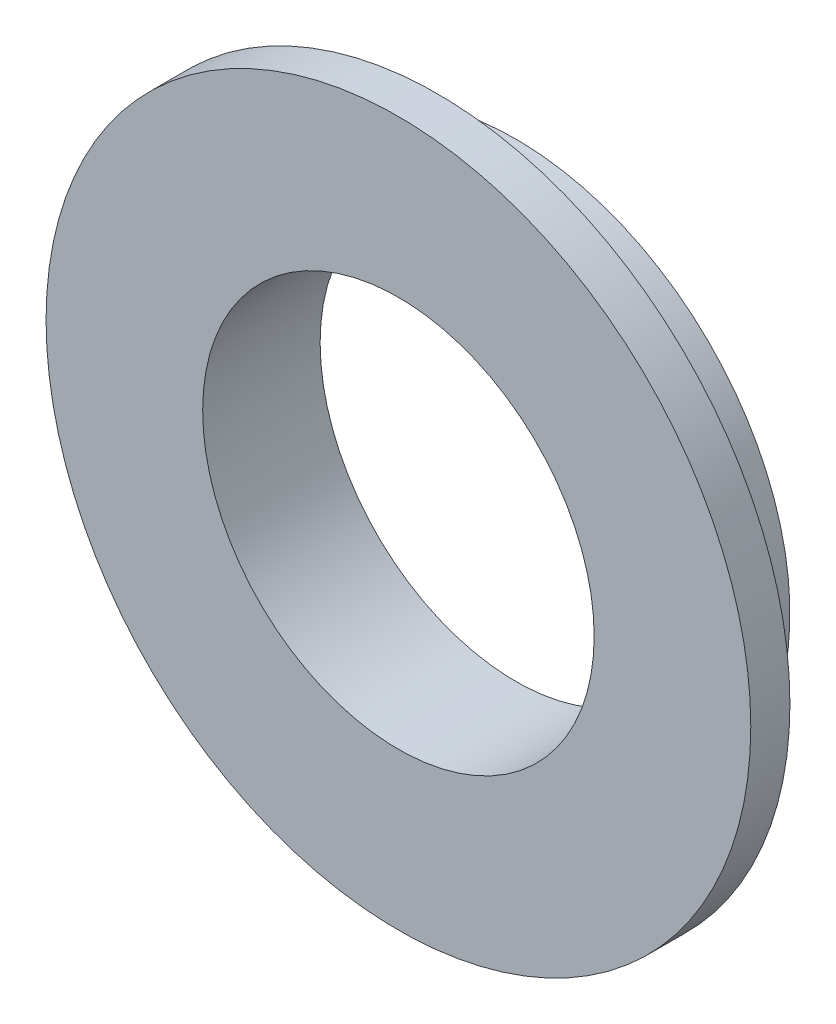
ISO-10303-21;
HEADER;
FILE_DESCRIPTION(('STEP AP214'),'2;1');
FILE_NAME('part.step','',(''),(''),'','','');
FILE_SCHEMA(('AUTOMOTIVE_DESIGN { 1 0 10303 214 1 1 1 1 }'));
ENDSEC;
DATA;
#1=APPLICATION_CONTEXT('core data for automotive mechanical design processes');
#2=APPLICATION_PROTOCOL_DEFINITION('international standard','automotive_design',2000,#1);
#3=PRODUCT_CONTEXT('',#1,'mechanical');
#4=PRODUCT('Part','Part','',(#3));
#5=PRODUCT_RELATED_PRODUCT_CATEGORY('part','',(#4));
#6=PRODUCT_DEFINITION_FORMATION('','',#4);
#7=PRODUCT_DEFINITION_CONTEXT('part definition',#1,'design');
#8=PRODUCT_DEFINITION('design','',#6,#7);
#9=PRODUCT_DEFINITION_SHAPE('','',#8);
#10=(LENGTH_UNIT() NAMED_UNIT(*) SI_UNIT(.MILLI.,.METRE.));
#11=(NAMED_UNIT(*) PLANE_ANGLE_UNIT() SI_UNIT($,.RADIAN.));
#12=(NAMED_UNIT(*) SI_UNIT($,.STERADIAN.) SOLID_ANGLE_UNIT());
#13=UNCERTAINTY_MEASURE_WITH_UNIT(LENGTH_MEASURE(1.E-05),#10,'distance_accuracy_value','');
#14=(GEOMETRIC_REPRESENTATION_CONTEXT(3) GLOBAL_UNCERTAINTY_ASSIGNED_CONTEXT((#13)) GLOBAL_UNIT_ASSIGNED_CONTEXT((#10,
#11,#12)) REPRESENTATION_CONTEXT('',''));
#15=CARTESIAN_POINT('',(0.,0.,0.));
#16=DIRECTION('',(0.,0.,1.));
#17=DIRECTION('',(1.,0.,0.));
#18=AXIS2_PLACEMENT_3D('',#15,#16,#17);
#19=CARTESIAN_POINT('',(0.,0.,-0.5));
#20=DIRECTION('',(0.,0.,1.));
#21=DIRECTION('',(1.,0.,0.));
#22=AXIS2_PLACEMENT_3D('',#19,#20,#21);
#23=CYLINDRICAL_SURFACE('',#22,2.5);
#24=CARTESIAN_POINT('',(0.,0.,0.));
#25=DIRECTION('',(0.,0.,1.));
#26=DIRECTION('',(1.,0.,0.));
#27=AXIS2_PLACEMENT_3D('',#24,#25,#26);
#28=CIRCLE('',#27,2.5);
#29=CARTESIAN_POINT('',(2.5,0.,0.));
#30=VERTEX_POINT('',#29);
#31=EDGE_CURVE('E10',#30,#30,#28,.T.);
#32=ORIENTED_EDGE('',*,*,#31,.T.);
#33=EDGE_LOOP('',(#32));
#34=FACE_BOUND('',#33,.T.);
#35=CARTESIAN_POINT('',(0.,0.,-1.5));
#36=DIRECTION('',(0.,0.,-1.));
#37=DIRECTION('',(-1.,0.,0.));
#38=AXIS2_PLACEMENT_3D('',#35,#36,#37);
#39=CIRCLE('',#38,2.5);
#40=CARTESIAN_POINT('',(-2.5,0.,-1.5));
#41=VERTEX_POINT('',#40);
#42=EDGE_CURVE('E21',#41,#41,#39,.F.);
#43=ORIENTED_EDGE('',*,*,#42,.F.);
#44=EDGE_LOOP('',(#43));
#45=FACE_BOUND('',#44,.T.);
#46=ADVANCED_FACE('F15',(#34,#45),#23,.F.);
#47=CARTESIAN_POINT('',(0.,0.,-0.5));
#48=DIRECTION('',(0.,0.,1.));
#49=DIRECTION('',(1.,0.,0.));
#50=AXIS2_PLACEMENT_3D('',#47,#48,#49);
#51=CYLINDRICAL_SURFACE('',#50,4.5);
#52=CARTESIAN_POINT('',(0.,0.,-0.5));
#53=DIRECTION('',(0.,0.,-1.));
#54=DIRECTION('',(-1.,0.,0.));
#55=AXIS2_PLACEMENT_3D('',#52,#53,#54);
#56=CIRCLE('',#55,4.5);
#57=CARTESIAN_POINT('',(-4.5,0.,-0.5));
#58=VERTEX_POINT('',#57);
#59=EDGE_CURVE('E25',#58,#58,#56,.T.);
#60=ORIENTED_EDGE('',*,*,#59,.F.);
#61=EDGE_LOOP('',(#60));
#62=FACE_BOUND('',#61,.T.);
#63=CARTESIAN_POINT('',(0.,0.,0.));
#64=DIRECTION('',(0.,0.,-1.));
#65=DIRECTION('',(-1.,0.,0.));
#66=AXIS2_PLACEMENT_3D('',#63,#64,#65);
#67=CIRCLE('',#66,4.5);
#68=CARTESIAN_POINT('',(-4.5,0.,0.));
#69=VERTEX_POINT('',#68);
#70=EDGE_CURVE('E29',#69,#69,#67,.T.);
#71=ORIENTED_EDGE('',*,*,#70,.T.);
#72=EDGE_LOOP('',(#71));
#73=FACE_BOUND('',#72,.T.);
#74=ADVANCED_FACE('F54',(#62,#73),#51,.T.);
#75=CARTESIAN_POINT('',(0.,0.,-0.5));
#76=DIRECTION('',(0.,0.,-1.));
#77=DIRECTION('',(1.,0.,0.));
#78=AXIS2_PLACEMENT_3D('',#75,#76,#77);
#79=PLANE('',#78);
#80=CARTESIAN_POINT('',(0.,0.,-0.5));
#81=DIRECTION('',(0.,0.,-1.));
#82=DIRECTION('',(-1.,0.,0.));
#83=AXIS2_PLACEMENT_3D('',#80,#81,#82);
#84=CIRCLE('',#83,3.5);
#85=CARTESIAN_POINT('',(-3.5,0.,-0.5));
#86=VERTEX_POINT('',#85);
#87=EDGE_CURVE('E34',#86,#86,#84,.T.);
#88=ORIENTED_EDGE('',*,*,#87,.F.);
#89=EDGE_LOOP('',(#88));
#90=FACE_BOUND('',#89,.T.);
#91=ORIENTED_EDGE('',*,*,#59,.T.);
#92=EDGE_LOOP('',(#91));
#93=FACE_BOUND('',#92,.T.);
#94=ADVANCED_FACE('F59',(#90,#93),#79,.T.);
#95=CARTESIAN_POINT('',(0.,0.,0.));
#96=DIRECTION('',(0.,0.,-1.));
#97=DIRECTION('',(1.,0.,0.));
#98=AXIS2_PLACEMENT_3D('',#95,#96,#97);
#99=PLANE('',#98);
#100=ORIENTED_EDGE('',*,*,#31,.F.);
#101=EDGE_LOOP('',(#100));
#102=FACE_BOUND('',#101,.T.);
#103=ORIENTED_EDGE('',*,*,#70,.F.);
#104=EDGE_LOOP('',(#103));
#105=FACE_BOUND('',#104,.T.);
#106=ADVANCED_FACE('F51',(#102,#105),#99,.F.);
#107=CARTESIAN_POINT('',(5.,0.,-1.5));
#108=DIRECTION('',(0.,0.,-1.));
#109=DIRECTION('',(-1.,0.,0.));
#110=AXIS2_PLACEMENT_3D('',#107,#108,#109);
#111=PLANE('',#110);
#112=ORIENTED_EDGE('',*,*,#42,.T.);
#113=EDGE_LOOP('',(#112));
#114=FACE_BOUND('',#113,.T.);
#115=CARTESIAN_POINT('',(0.,0.,-1.5));
#116=DIRECTION('',(0.,0.,-1.));
#117=DIRECTION('',(-1.,0.,0.));
#118=AXIS2_PLACEMENT_3D('',#115,#116,#117);
#119=CIRCLE('',#118,3.5);
#120=CARTESIAN_POINT('',(-3.5,0.,-1.5));
#121=VERTEX_POINT('',#120);
#122=EDGE_CURVE('E37',#121,#121,#119,.T.);
#123=ORIENTED_EDGE('',*,*,#122,.T.);
#124=EDGE_LOOP('',(#123));
#125=FACE_BOUND('',#124,.T.);
#126=ADVANCED_FACE('F41',(#114,#125),#111,.T.);
#127=CARTESIAN_POINT('',(0.,0.,-280.821562505811));
#128=DIRECTION('',(0.,0.,1.));
#129=DIRECTION('',(1.,0.,0.));
#130=AXIS2_PLACEMENT_3D('',#127,#128,#129);
#131=CYLINDRICAL_SURFACE('',#130,3.5);
#132=ORIENTED_EDGE('',*,*,#87,.T.);
#133=EDGE_LOOP('',(#132));
#134=FACE_BOUND('',#133,.T.);
#135=ORIENTED_EDGE('',*,*,#122,.F.);
#136=EDGE_LOOP('',(#135));
#137=FACE_BOUND('',#136,.T.);
#138=ADVANCED_FACE('F43',(#134,#137),#131,.T.);
#139=CLOSED_SHELL('',(#46,#74,#94,#106,#126,#138));
#140=MANIFOLD_SOLID_BREP('B1',#139);
#141=ADVANCED_BREP_SHAPE_REPRESENTATION('',(#18,#140),#14);
#142=SHAPE_DEFINITION_REPRESENTATION(#9,#141);
ENDSEC;
END-ISO-10303-21;
